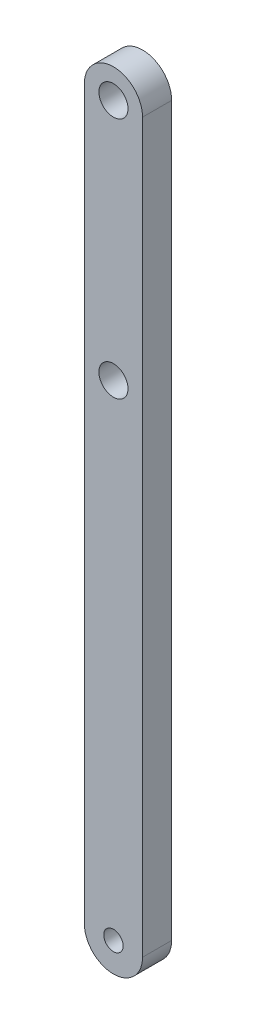
ISO-10303-21;
HEADER;
FILE_DESCRIPTION(('STEP AP214'),'2;1');
FILE_NAME('part.step','',(''),(''),'','','');
FILE_SCHEMA(('AUTOMOTIVE_DESIGN { 1 0 10303 214 1 1 1 1 }'));
ENDSEC;
DATA;
#1=APPLICATION_CONTEXT('core data for automotive mechanical design processes');
#2=APPLICATION_PROTOCOL_DEFINITION('international standard','automotive_design',2000,#1);
#3=PRODUCT_CONTEXT('',#1,'mechanical');
#4=PRODUCT('Part','Part','',(#3));
#5=PRODUCT_RELATED_PRODUCT_CATEGORY('part','',(#4));
#6=PRODUCT_DEFINITION_FORMATION('','',#4);
#7=PRODUCT_DEFINITION_CONTEXT('part definition',#1,'design');
#8=PRODUCT_DEFINITION('design','',#6,#7);
#9=PRODUCT_DEFINITION_SHAPE('','',#8);
#10=(LENGTH_UNIT() NAMED_UNIT(*) SI_UNIT(.MILLI.,.METRE.));
#11=(NAMED_UNIT(*) PLANE_ANGLE_UNIT() SI_UNIT($,.RADIAN.));
#12=(NAMED_UNIT(*) SI_UNIT($,.STERADIAN.) SOLID_ANGLE_UNIT());
#13=UNCERTAINTY_MEASURE_WITH_UNIT(LENGTH_MEASURE(1.E-05),#10,'distance_accuracy_value','');
#14=(GEOMETRIC_REPRESENTATION_CONTEXT(3) GLOBAL_UNCERTAINTY_ASSIGNED_CONTEXT((#13)) GLOBAL_UNIT_ASSIGNED_CONTEXT((#10,
#11,#12)) REPRESENTATION_CONTEXT('',''));
#15=CARTESIAN_POINT('',(0.,0.,0.));
#16=DIRECTION('',(0.,0.,1.));
#17=DIRECTION('',(1.,0.,0.));
#18=AXIS2_PLACEMENT_3D('',#15,#16,#17);
#19=CARTESIAN_POINT('',(0.,36.9888899977329,-4.5));
#20=DIRECTION('',(0.,0.,1.));
#21=DIRECTION('',(1.,0.,0.));
#22=AXIS2_PLACEMENT_3D('',#19,#20,#21);
#23=CYLINDRICAL_SURFACE('',#22,2.99999999999999);
#24=CARTESIAN_POINT('',(0.,36.9888899977329,-1.5));
#25=DIRECTION('',(0.,0.,1.));
#26=DIRECTION('',(1.,0.,0.));
#27=AXIS2_PLACEMENT_3D('',#24,#25,#26);
#28=CIRCLE('',#27,2.99999999999999);
#29=CARTESIAN_POINT('',(2.99999999999997,36.9888899977329,-1.5));
#30=VERTEX_POINT('',#29);
#31=CARTESIAN_POINT('',(-3.,36.9888899977329,-1.5));
#32=VERTEX_POINT('',#31);
#33=EDGE_CURVE('E100',#30,#32,#28,.T.);
#34=ORIENTED_EDGE('',*,*,#33,.F.);
#35=DIRECTION('',(0.,0.,1.));
#36=VECTOR('',#35,1.);
#37=CARTESIAN_POINT('',(2.99999999999997,36.9888899977329,-4.5));
#38=LINE('',#37,#36);
#39=CARTESIAN_POINT('',(2.99999999999997,36.9888899977329,-4.5));
#40=VERTEX_POINT('',#39);
#41=EDGE_CURVE('E11',#40,#30,#38,.T.);
#42=ORIENTED_EDGE('',*,*,#41,.F.);
#43=CARTESIAN_POINT('',(0.,36.9888899977329,-4.5));
#44=DIRECTION('',(0.,0.,1.));
#45=DIRECTION('',(1.,0.,0.));
#46=AXIS2_PLACEMENT_3D('',#43,#44,#45);
#47=CIRCLE('',#46,2.99999999999999);
#48=CARTESIAN_POINT('',(-3.,36.9888899977329,-4.5));
#49=VERTEX_POINT('',#48);
#50=EDGE_CURVE('E93',#40,#49,#47,.T.);
#51=ORIENTED_EDGE('',*,*,#50,.T.);
#52=DIRECTION('',(0.,0.,1.));
#53=VECTOR('',#52,1.);
#54=CARTESIAN_POINT('',(-3.,36.9888899977329,-4.5));
#55=LINE('',#54,#53);
#56=EDGE_CURVE('E38',#49,#32,#55,.T.);
#57=ORIENTED_EDGE('',*,*,#56,.T.);
#58=EDGE_LOOP('',(#34,#42,#51,#57));
#59=FACE_BOUND('',#58,.T.);
#60=ADVANCED_FACE('F35',(#59),#23,.T.);
#61=CARTESIAN_POINT('',(2.99999999999997,36.9888899977329,-4.5));
#62=DIRECTION('',(1.,0.,0.));
#63=DIRECTION('',(0.,1.,0.));
#64=AXIS2_PLACEMENT_3D('',#61,#62,#63);
#65=PLANE('',#64);
#66=DIRECTION('',(0.,1.,0.));
#67=VECTOR('',#66,1.);
#68=CARTESIAN_POINT('',(2.99999999999997,36.9888899977329,-1.5));
#69=LINE('',#68,#67);
#70=CARTESIAN_POINT('',(2.99999999999999,-38.0111100022671,-1.5));
#71=VERTEX_POINT('',#70);
#72=EDGE_CURVE('E95',#71,#30,#69,.T.);
#73=ORIENTED_EDGE('',*,*,#72,.F.);
#74=DIRECTION('',(0.,0.,1.));
#75=VECTOR('',#74,1.);
#76=CARTESIAN_POINT('',(2.99999999999999,-38.0111100022671,-4.5));
#77=LINE('',#76,#75);
#78=CARTESIAN_POINT('',(2.99999999999999,-38.0111100022671,-4.5));
#79=VERTEX_POINT('',#78);
#80=EDGE_CURVE('E44',#79,#71,#77,.T.);
#81=ORIENTED_EDGE('',*,*,#80,.F.);
#82=DIRECTION('',(0.,1.,0.));
#83=VECTOR('',#82,1.);
#84=CARTESIAN_POINT('',(2.99999999999997,36.9888899977329,-4.5));
#85=LINE('',#84,#83);
#86=EDGE_CURVE('E90',#79,#40,#85,.T.);
#87=ORIENTED_EDGE('',*,*,#86,.T.);
#88=ORIENTED_EDGE('',*,*,#41,.T.);
#89=EDGE_LOOP('',(#73,#81,#87,#88));
#90=FACE_BOUND('',#89,.T.);
#91=ADVANCED_FACE('F111',(#90),#65,.T.);
#92=CARTESIAN_POINT('',(0.,-38.0111100022671,-4.5));
#93=DIRECTION('',(0.,0.,1.));
#94=DIRECTION('',(1.,0.,0.));
#95=AXIS2_PLACEMENT_3D('',#92,#93,#94);
#96=CYLINDRICAL_SURFACE('',#95,2.99999999999999);
#97=CARTESIAN_POINT('',(0.,-38.0111100022671,-1.5));
#98=DIRECTION('',(0.,0.,1.));
#99=DIRECTION('',(1.,0.,0.));
#100=AXIS2_PLACEMENT_3D('',#97,#98,#99);
#101=CIRCLE('',#100,2.99999999999999);
#102=CARTESIAN_POINT('',(-2.99999999999998,-38.0111100022671,-1.5));
#103=VERTEX_POINT('',#102);
#104=EDGE_CURVE('E85',#103,#71,#101,.T.);
#105=ORIENTED_EDGE('',*,*,#104,.F.);
#106=DIRECTION('',(0.,0.,1.));
#107=VECTOR('',#106,1.);
#108=CARTESIAN_POINT('',(-2.99999999999998,-38.0111100022671,-4.5));
#109=LINE('',#108,#107);
#110=CARTESIAN_POINT('',(-2.99999999999998,-38.0111100022671,-4.5));
#111=VERTEX_POINT('',#110);
#112=EDGE_CURVE('E80',#111,#103,#109,.T.);
#113=ORIENTED_EDGE('',*,*,#112,.F.);
#114=CARTESIAN_POINT('',(0.,-38.0111100022671,-4.5));
#115=DIRECTION('',(0.,0.,1.));
#116=DIRECTION('',(1.,0.,0.));
#117=AXIS2_PLACEMENT_3D('',#114,#115,#116);
#118=CIRCLE('',#117,2.99999999999999);
#119=EDGE_CURVE('E83',#111,#79,#118,.T.);
#120=ORIENTED_EDGE('',*,*,#119,.T.);
#121=ORIENTED_EDGE('',*,*,#80,.T.);
#122=EDGE_LOOP('',(#105,#113,#120,#121));
#123=FACE_BOUND('',#122,.T.);
#124=ADVANCED_FACE('F82',(#123),#96,.T.);
#125=CARTESIAN_POINT('',(-3.,36.9888899977329,-4.5));
#126=DIRECTION('',(-1.,0.,0.));
#127=DIRECTION('',(0.,-1.,0.));
#128=AXIS2_PLACEMENT_3D('',#125,#126,#127);
#129=PLANE('',#128);
#130=DIRECTION('',(0.,-1.,0.));
#131=VECTOR('',#130,1.);
#132=CARTESIAN_POINT('',(-3.,36.9888899977329,-1.5));
#133=LINE('',#132,#131);
#134=EDGE_CURVE('E103',#32,#103,#133,.T.);
#135=ORIENTED_EDGE('',*,*,#134,.F.);
#136=ORIENTED_EDGE('',*,*,#56,.F.);
#137=DIRECTION('',(0.,-1.,0.));
#138=VECTOR('',#137,1.);
#139=CARTESIAN_POINT('',(-3.,36.9888899977329,-4.5));
#140=LINE('',#139,#138);
#141=EDGE_CURVE('E89',#49,#111,#140,.T.);
#142=ORIENTED_EDGE('',*,*,#141,.T.);
#143=ORIENTED_EDGE('',*,*,#112,.T.);
#144=EDGE_LOOP('',(#135,#136,#142,#143));
#145=FACE_BOUND('',#144,.T.);
#146=ADVANCED_FACE('F92',(#145),#129,.T.);
#147=CARTESIAN_POINT('',(0.,36.9888899977329,-4.5));
#148=DIRECTION('',(0.,0.,1.));
#149=DIRECTION('',(1.,0.,0.));
#150=AXIS2_PLACEMENT_3D('',#147,#148,#149);
#151=PLANE('',#150);
#152=CARTESIAN_POINT('',(0.,-38.0111100022671,-4.5));
#153=DIRECTION('',(0.,0.,1.));
#154=DIRECTION('',(1.,0.,0.));
#155=AXIS2_PLACEMENT_3D('',#152,#153,#154);
#156=CIRCLE('',#155,1.);
#157=CARTESIAN_POINT('',(1.00000000000001,-38.0111100022671,-4.5));
#158=VERTEX_POINT('',#157);
#159=EDGE_CURVE('E148',#158,#158,#156,.T.);
#160=ORIENTED_EDGE('',*,*,#159,.T.);
#161=EDGE_LOOP('',(#160));
#162=FACE_BOUND('',#161,.T.);
#163=CARTESIAN_POINT('',(0.,11.9888899977329,-4.5));
#164=DIRECTION('',(0.,0.,1.));
#165=DIRECTION('',(1.,0.,0.));
#166=AXIS2_PLACEMENT_3D('',#163,#164,#165);
#167=CIRCLE('',#166,1.5);
#168=CARTESIAN_POINT('',(1.5,11.9888899977329,-4.5));
#169=VERTEX_POINT('',#168);
#170=EDGE_CURVE('E156',#169,#169,#167,.T.);
#171=ORIENTED_EDGE('',*,*,#170,.T.);
#172=EDGE_LOOP('',(#171));
#173=FACE_BOUND('',#172,.T.);
#174=CARTESIAN_POINT('',(0.,36.9888899977329,-4.5));
#175=DIRECTION('',(0.,0.,1.));
#176=DIRECTION('',(1.,0.,0.));
#177=AXIS2_PLACEMENT_3D('',#174,#175,#176);
#178=CIRCLE('',#177,1.5);
#179=CARTESIAN_POINT('',(1.49999999999999,36.9888899977329,-4.5));
#180=VERTEX_POINT('',#179);
#181=EDGE_CURVE('E104',#180,#180,#178,.T.);
#182=ORIENTED_EDGE('',*,*,#181,.T.);
#183=EDGE_LOOP('',(#182));
#184=FACE_BOUND('',#183,.T.);
#185=ORIENTED_EDGE('',*,*,#50,.F.);
#186=ORIENTED_EDGE('',*,*,#86,.F.);
#187=ORIENTED_EDGE('',*,*,#119,.F.);
#188=ORIENTED_EDGE('',*,*,#141,.F.);
#189=EDGE_LOOP('',(#185,#186,#187,#188));
#190=FACE_BOUND('',#189,.T.);
#191=ADVANCED_FACE('F88',(#162,#173,#184,#190),#151,.F.);
#192=CARTESIAN_POINT('',(0.,36.9888899977329,-1.5));
#193=DIRECTION('',(0.,0.,1.));
#194=DIRECTION('',(1.,0.,0.));
#195=AXIS2_PLACEMENT_3D('',#192,#193,#194);
#196=PLANE('',#195);
#197=CARTESIAN_POINT('',(0.,-38.0111100022671,-1.5));
#198=DIRECTION('',(0.,0.,1.));
#199=DIRECTION('',(1.,0.,0.));
#200=AXIS2_PLACEMENT_3D('',#197,#198,#199);
#201=CIRCLE('',#200,1.);
#202=CARTESIAN_POINT('',(1.00000000000001,-38.0111100022671,-1.5));
#203=VERTEX_POINT('',#202);
#204=EDGE_CURVE('E151',#203,#203,#201,.T.);
#205=ORIENTED_EDGE('',*,*,#204,.F.);
#206=EDGE_LOOP('',(#205));
#207=FACE_BOUND('',#206,.T.);
#208=CARTESIAN_POINT('',(0.,11.9888899977329,-1.5));
#209=DIRECTION('',(0.,0.,1.));
#210=DIRECTION('',(1.,0.,0.));
#211=AXIS2_PLACEMENT_3D('',#208,#209,#210);
#212=CIRCLE('',#211,1.5);
#213=CARTESIAN_POINT('',(1.5,11.9888899977329,-1.5));
#214=VERTEX_POINT('',#213);
#215=EDGE_CURVE('E153',#214,#214,#212,.T.);
#216=ORIENTED_EDGE('',*,*,#215,.F.);
#217=EDGE_LOOP('',(#216));
#218=FACE_BOUND('',#217,.T.);
#219=CARTESIAN_POINT('',(0.,36.9888899977329,-1.5));
#220=DIRECTION('',(0.,0.,1.));
#221=DIRECTION('',(1.,0.,0.));
#222=AXIS2_PLACEMENT_3D('',#219,#220,#221);
#223=CIRCLE('',#222,1.5);
#224=CARTESIAN_POINT('',(1.49999999999999,36.9888899977329,-1.5));
#225=VERTEX_POINT('',#224);
#226=EDGE_CURVE('E159',#225,#225,#223,.T.);
#227=ORIENTED_EDGE('',*,*,#226,.F.);
#228=EDGE_LOOP('',(#227));
#229=FACE_BOUND('',#228,.T.);
#230=ORIENTED_EDGE('',*,*,#33,.T.);
#231=ORIENTED_EDGE('',*,*,#134,.T.);
#232=ORIENTED_EDGE('',*,*,#104,.T.);
#233=ORIENTED_EDGE('',*,*,#72,.T.);
#234=EDGE_LOOP('',(#230,#231,#232,#233));
#235=FACE_BOUND('',#234,.T.);
#236=ADVANCED_FACE('F110',(#207,#218,#229,#235),#196,.T.);
#237=CARTESIAN_POINT('',(0.,36.9888899977329,-4.5));
#238=DIRECTION('',(0.,0.,1.));
#239=DIRECTION('',(1.,0.,0.));
#240=AXIS2_PLACEMENT_3D('',#237,#238,#239);
#241=CYLINDRICAL_SURFACE('',#240,1.5);
#242=ORIENTED_EDGE('',*,*,#181,.F.);
#243=EDGE_LOOP('',(#242));
#244=FACE_BOUND('',#243,.T.);
#245=ORIENTED_EDGE('',*,*,#226,.T.);
#246=EDGE_LOOP('',(#245));
#247=FACE_BOUND('',#246,.T.);
#248=ADVANCED_FACE('F129',(#244,#247),#241,.F.);
#249=CARTESIAN_POINT('',(0.,11.9888899977329,-4.5));
#250=DIRECTION('',(0.,0.,1.));
#251=DIRECTION('',(1.,0.,0.));
#252=AXIS2_PLACEMENT_3D('',#249,#250,#251);
#253=CYLINDRICAL_SURFACE('',#252,1.5);
#254=ORIENTED_EDGE('',*,*,#170,.F.);
#255=EDGE_LOOP('',(#254));
#256=FACE_BOUND('',#255,.T.);
#257=ORIENTED_EDGE('',*,*,#215,.T.);
#258=EDGE_LOOP('',(#257));
#259=FACE_BOUND('',#258,.T.);
#260=ADVANCED_FACE('F136',(#256,#259),#253,.F.);
#261=CARTESIAN_POINT('',(0.,-38.0111100022671,-4.5));
#262=DIRECTION('',(0.,0.,1.));
#263=DIRECTION('',(1.,0.,0.));
#264=AXIS2_PLACEMENT_3D('',#261,#262,#263);
#265=CYLINDRICAL_SURFACE('',#264,1.);
#266=ORIENTED_EDGE('',*,*,#159,.F.);
#267=EDGE_LOOP('',(#266));
#268=FACE_BOUND('',#267,.T.);
#269=ORIENTED_EDGE('',*,*,#204,.T.);
#270=EDGE_LOOP('',(#269));
#271=FACE_BOUND('',#270,.T.);
#272=ADVANCED_FACE('F140',(#268,#271),#265,.F.);
#273=CLOSED_SHELL('',(#60,#91,#124,#146,#191,#236,#248,#260,#272));
#274=MANIFOLD_SOLID_BREP('B2',#273);
#275=ADVANCED_BREP_SHAPE_REPRESENTATION('',(#18,#274),#14);
#276=SHAPE_DEFINITION_REPRESENTATION(#9,#275);
ENDSEC;
END-ISO-10303-21;
